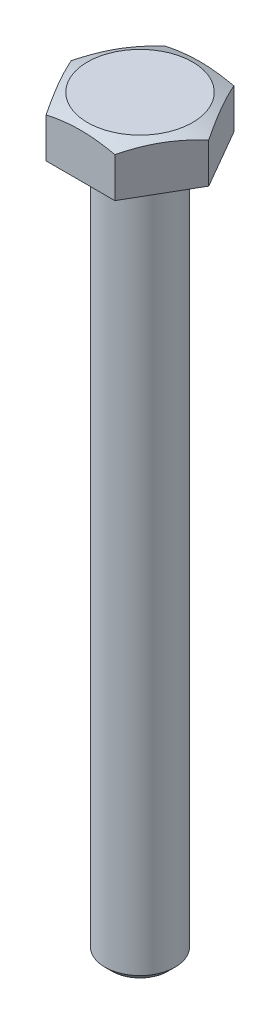
ISO-10303-21;
HEADER;
FILE_DESCRIPTION(('STEP AP214'),'2;1');
FILE_NAME('part.step','',(''),(''),'','','');
FILE_SCHEMA(('AUTOMOTIVE_DESIGN { 1 0 10303 214 1 1 1 1 }'));
ENDSEC;
DATA;
#1=APPLICATION_CONTEXT('core data for automotive mechanical design processes');
#2=APPLICATION_PROTOCOL_DEFINITION('international standard','automotive_design',2000,#1);
#3=PRODUCT_CONTEXT('',#1,'mechanical');
#4=PRODUCT('Part','Part','',(#3));
#5=PRODUCT_RELATED_PRODUCT_CATEGORY('part','',(#4));
#6=PRODUCT_DEFINITION_FORMATION('','',#4);
#7=PRODUCT_DEFINITION_CONTEXT('part definition',#1,'design');
#8=PRODUCT_DEFINITION('design','',#6,#7);
#9=PRODUCT_DEFINITION_SHAPE('','',#8);
#10=(LENGTH_UNIT() NAMED_UNIT(*) SI_UNIT(.MILLI.,.METRE.));
#11=(NAMED_UNIT(*) PLANE_ANGLE_UNIT() SI_UNIT($,.RADIAN.));
#12=(NAMED_UNIT(*) SI_UNIT($,.STERADIAN.) SOLID_ANGLE_UNIT());
#13=UNCERTAINTY_MEASURE_WITH_UNIT(LENGTH_MEASURE(1.E-05),#10,'distance_accuracy_value','');
#14=(GEOMETRIC_REPRESENTATION_CONTEXT(3) GLOBAL_UNCERTAINTY_ASSIGNED_CONTEXT((#13)) GLOBAL_UNIT_ASSIGNED_CONTEXT((#10,
#11,#12)) REPRESENTATION_CONTEXT('',''));
#15=CARTESIAN_POINT('',(0.,0.,0.));
#16=DIRECTION('',(0.,0.,1.));
#17=DIRECTION('',(1.,0.,0.));
#18=AXIS2_PLACEMENT_3D('',#15,#16,#17);
#19=CARTESIAN_POINT('',(4.90747728811192,6.7,8.49999999999995));
#20=DIRECTION('',(-0.866025403784442,0.,-0.499999999999995));
#21=DIRECTION('',(-0.499999999999995,0.,0.866025403784442));
#22=AXIS2_PLACEMENT_3D('',#19,#20,#21);
#23=PLANE('',#22);
#24=CARTESIAN_POINT('',(4.90736181805808,5.69995011906818,8.50019999999995));
#25=CARTESIAN_POINT('',(5.06766332292596,5.76919852924172,8.22254964903904));
#26=CARTESIAN_POINT('',(5.22852208946058,5.83360275520303,7.9439340925582));
#27=CARTESIAN_POINT('',(5.55136884100987,5.95096558837473,7.38474711581626));
#28=CARTESIAN_POINT('',(5.71335741295552,6.00391770493586,7.10417467896087));
#29=CARTESIAN_POINT('',(6.03834482030254,6.09655033662872,6.54127997761574));
#30=CARTESIAN_POINT('',(6.20134393866038,6.13622694619533,6.25895722303102));
#31=CARTESIAN_POINT('',(6.52805379498716,6.20065778964709,5.69307915253951));
#32=CARTESIAN_POINT('',(6.69176438030418,6.22541507941706,5.40952410103359));
#33=CARTESIAN_POINT('',(7.01653681894995,6.25855539155112,4.84700173640106));
#34=CARTESIAN_POINT('',(7.17759098231728,6.26723583654308,4.56804774267834));
#35=CARTESIAN_POINT('',(7.4997300615107,6.26871290776376,4.01008649041187));
#36=CARTESIAN_POINT('',(7.6608149787261,6.26150836860822,3.73107922946177));
#37=CARTESIAN_POINT('',(7.98249254918383,6.23157315446633,3.17391733377366));
#38=CARTESIAN_POINT('',(8.14308548631427,6.20885446130092,2.89576220732701));
#39=CARTESIAN_POINT('',(8.46357349646353,6.14893290538069,2.34066069053184));
#40=CARTESIAN_POINT('',(8.62346863468007,6.11173142642646,2.06371418725754));
#41=CARTESIAN_POINT('',(8.86926678639967,6.04436735447213,1.63797930007267));
#42=CARTESIAN_POINT('',(8.95549336359126,6.01879365253318,1.48863048741406));
#43=CARTESIAN_POINT('',(9.12765467535119,5.96410441604229,1.19043834834817));
#44=CARTESIAN_POINT('',(9.21358944651567,5.93498934386047,1.04159495855447));
#45=CARTESIAN_POINT('',(9.38562432190309,5.87331939986806,0.743621813709675));
#46=CARTESIAN_POINT('',(9.4717228383626,5.84074690620565,0.594494808745514));
#47=CARTESIAN_POINT('',(9.64362156321177,5.77256126479486,0.296757483550436));
#48=CARTESIAN_POINT('',(9.72942176208916,5.73694802099658,0.148147179795281));
#49=CARTESIAN_POINT('',(9.81507004627748,5.6999501190682,-0.000200000000001539));
#50=B_SPLINE_CURVE_WITH_KNOTS('',3,(#24,#25,#26,#27,#28,#29,#30,#31,#32,#33,#34,#35,#36,#37,#38,
#39,#40,#41,#42,#43,#44,#45,#46,#47,#48,#49),.UNSPECIFIED.,.F.,.F.,(4,2,2,2,2,2,2,2,2,2,2,2,4),
(0.,0.984051741370098,1.96865975520475,2.95355717994528,3.93825280212149,4.90454218826444,
5.87090246751688,6.8365172546141,7.80203980182691,8.32502571912641,8.84794342722947,
9.37366748381706,9.89940815289629),.UNSPECIFIED.);
#51=CARTESIAN_POINT('',(4.90747728811218,5.7,8.49999999999995));
#52=VERTEX_POINT('',#51);
#53=CARTESIAN_POINT('',(9.81495457622382,5.7,2.97505076130022E-13));
#54=VERTEX_POINT('',#53);
#55=EDGE_CURVE('E96',#52,#54,#50,.T.);
#56=ORIENTED_EDGE('',*,*,#55,.F.);
#57=DIRECTION('',(0.,-1.,0.));
#58=VECTOR('',#57,1.);
#59=CARTESIAN_POINT('',(4.90747728811192,6.7,8.49999999999995));
#60=LINE('',#59,#58);
#61=CARTESIAN_POINT('',(4.90747728811192,0.,8.49999999999995));
#62=VERTEX_POINT('',#61);
#63=EDGE_CURVE('E61',#52,#62,#60,.T.);
#64=ORIENTED_EDGE('',*,*,#63,.T.);
#65=DIRECTION('',(0.499999999999995,0.,-0.866025403784442));
#66=VECTOR('',#65,1.);
#67=CARTESIAN_POINT('',(4.90747728811192,0.,8.49999999999995));
#68=LINE('',#67,#66);
#69=CARTESIAN_POINT('',(9.81495457622365,0.,0.));
#70=VERTEX_POINT('',#69);
#71=EDGE_CURVE('E191',#62,#70,#68,.T.);
#72=ORIENTED_EDGE('',*,*,#71,.T.);
#73=DIRECTION('',(0.,-1.,0.));
#74=VECTOR('',#73,1.);
#75=CARTESIAN_POINT('',(9.81495457622365,6.7,0.));
#76=LINE('',#75,#74);
#77=EDGE_CURVE('E114',#54,#70,#76,.T.);
#78=ORIENTED_EDGE('',*,*,#77,.F.);
#79=EDGE_LOOP('',(#56,#64,#72,#78));
#80=FACE_BOUND('',#79,.T.);
#81=ADVANCED_FACE('F37',(#80),#23,.F.);
#82=CARTESIAN_POINT('',(9.81495457622365,6.7,0.));
#83=DIRECTION('',(-0.866025403784438,0.,0.500000000000001));
#84=DIRECTION('',(0.500000000000001,0.,0.866025403784438));
#85=AXIS2_PLACEMENT_3D('',#82,#83,#84);
#86=PLANE('',#85);
#87=CARTESIAN_POINT('',(9.81507004627748,5.6999501190682,0.000200000000000027));
#88=CARTESIAN_POINT('',(9.65476854140961,5.76919852924174,-0.27745035096091));
#89=CARTESIAN_POINT('',(9.49390977487498,5.83360275520305,-0.556065907441743));
#90=CARTESIAN_POINT('',(9.17106302332569,5.95096558837475,-1.11525288418368));
#91=CARTESIAN_POINT('',(9.00907445138004,6.00391770493587,-1.39582532103907));
#92=CARTESIAN_POINT('',(8.68408704403302,6.09655033662874,-1.95872002238419));
#93=CARTESIAN_POINT('',(8.52108792567518,6.13622694619535,-2.24104277696891));
#94=CARTESIAN_POINT('',(8.1943780693484,6.2006577896471,-2.80692084746042));
#95=CARTESIAN_POINT('',(8.03066748403138,6.22541507941707,-3.09047589896634));
#96=CARTESIAN_POINT('',(7.70589504538561,6.25855539155114,-3.65299826359886));
#97=CARTESIAN_POINT('',(7.54484088201827,6.26723583654309,-3.93195225732157));
#98=CARTESIAN_POINT('',(7.22270180282484,6.26871290776377,-4.48991350958804));
#99=CARTESIAN_POINT('',(7.06161688560945,6.26150836860823,-4.76892077053814));
#100=CARTESIAN_POINT('',(6.73993931515172,6.23157315446634,-5.32608266622624));
#101=CARTESIAN_POINT('',(6.57934637802127,6.20885446130094,-5.60423779267289));
#102=CARTESIAN_POINT('',(6.25885836787201,6.14893290538071,-6.15933930946805));
#103=CARTESIAN_POINT('',(6.09896322965547,6.11173142642647,-6.43628581274236));
#104=CARTESIAN_POINT('',(5.85316507793586,6.04436735447214,-6.86202069992724));
#105=CARTESIAN_POINT('',(5.76693850074426,6.01879365253319,-7.01136951258585));
#106=CARTESIAN_POINT('',(5.59477718898432,5.9641044160423,-7.30956165165176));
#107=CARTESIAN_POINT('',(5.50884241781983,5.93498934386047,-7.45840504144548));
#108=CARTESIAN_POINT('',(5.33680754243239,5.87331939986806,-7.75637818629029));
#109=CARTESIAN_POINT('',(5.25070902597288,5.84074690620565,-7.90550519125447));
#110=CARTESIAN_POINT('',(5.07881030112369,5.77256126479485,-8.20324251644957));
#111=CARTESIAN_POINT('',(4.9930101022463,5.73694802099657,-8.35185282020473));
#112=CARTESIAN_POINT('',(4.90736181805796,5.69995011906818,-8.50020000000002));
#113=B_SPLINE_CURVE_WITH_KNOTS('',3,(#87,#88,#89,#90,#91,#92,#93,#94,#95,#96,#97,#98,#99,#100,
#101,#102,#103,#104,#105,#106,#107,#108,#109,#110,#111,#112),.UNSPECIFIED.,.F.,.F.,(4,2,2,2,2,2,
2,2,2,2,2,2,4),(0.,0.984051741370094,1.96865975520474,2.95355717994527,3.93825280212147,
4.90454218826441,5.87090246751685,6.83651725461406,7.80203980182688,8.32502571912641,
8.84794342722951,9.37366748381714,9.89940815289641),.UNSPECIFIED.);
#114=CARTESIAN_POINT('',(4.90747728811206,5.7,-8.50000000000002));
#115=VERTEX_POINT('',#114);
#116=EDGE_CURVE('E91',#54,#115,#113,.T.);
#117=ORIENTED_EDGE('',*,*,#116,.F.);
#118=ORIENTED_EDGE('',*,*,#77,.T.);
#119=DIRECTION('',(-0.500000000000001,0.,-0.866025403784438));
#120=VECTOR('',#119,1.);
#121=CARTESIAN_POINT('',(9.81495457622365,0.,0.));
#122=LINE('',#121,#120);
#123=CARTESIAN_POINT('',(4.9074772881118,0.,-8.50000000000002));
#124=VERTEX_POINT('',#123);
#125=EDGE_CURVE('E112',#70,#124,#122,.T.);
#126=ORIENTED_EDGE('',*,*,#125,.T.);
#127=DIRECTION('',(0.,-1.,0.));
#128=VECTOR('',#127,1.);
#129=CARTESIAN_POINT('',(4.9074772881118,6.7,-8.50000000000002));
#130=LINE('',#129,#128);
#131=EDGE_CURVE('E105',#115,#124,#130,.T.);
#132=ORIENTED_EDGE('',*,*,#131,.F.);
#133=EDGE_LOOP('',(#117,#118,#126,#132));
#134=FACE_BOUND('',#133,.T.);
#135=ADVANCED_FACE('F110',(#134),#86,.F.);
#136=CARTESIAN_POINT('',(4.9074772881118,6.7,-8.50000000000002));
#137=DIRECTION('',(0.,0.,1.));
#138=DIRECTION('',(1.,0.,0.));
#139=AXIS2_PLACEMENT_3D('',#136,#137,#138);
#140=PLANE('',#139);
#141=CARTESIAN_POINT('',(14.7734430127443,2.57715623788736,-8.50000000000006));
#142=CARTESIAN_POINT('',(14.5301100118234,2.66826317609697,-8.50000000000006));
#143=CARTESIAN_POINT('',(14.2865950674088,2.75888401437732,-8.50000000000006));
#144=CARTESIAN_POINT('',(13.7991535895868,2.93901853009639,-8.50000000000005));
#145=CARTESIAN_POINT('',(13.5552270524079,3.02853219732672,-8.50000000000005));
#146=CARTESIAN_POINT('',(12.822693267771,3.29523368976502,-8.50000000000005));
#147=CARTESIAN_POINT('',(12.3334035389433,3.47055507329112,-8.50000000000005));
#148=CARTESIAN_POINT('',(11.3492616474874,3.81593130281965,-8.50000000000004));
#149=CARTESIAN_POINT('',(10.8543942108451,3.98594276559382,-8.50000000000004));
#150=CARTESIAN_POINT('',(9.8618060761074,4.31740205687568,-8.50000000000004));
#151=CARTESIAN_POINT('',(9.36408549327459,4.47885022866236,-8.50000000000004));
#152=CARTESIAN_POINT('',(8.37553211094848,4.78707952362426,-8.50000000000003));
#153=CARTESIAN_POINT('',(7.88477355941962,4.93409711588044,-8.50000000000003));
#154=CARTESIAN_POINT('',(6.899025516416,5.21352452169852,-8.50000000000003));
#155=CARTESIAN_POINT('',(6.40403567953657,5.34593313020276,-8.50000000000002));
#156=CARTESIAN_POINT('',(5.41035963620797,5.59087718020008,-8.50000000000002));
#157=CARTESIAN_POINT('',(4.91168520810618,5.70345973163224,-8.50000000000002));
#158=CARTESIAN_POINT('',(3.90918343469131,5.90288735275823,-8.50000000000002));
#159=CARTESIAN_POINT('',(3.40535716282511,5.98973767540247,-8.50000000000001));
#160=CARTESIAN_POINT('',(2.50282948547589,6.11559068739164,-8.50000000000001));
#161=CARTESIAN_POINT('',(2.10501472325678,6.1608842917115,-8.50000000000001));
#162=CARTESIAN_POINT('',(1.30743525754827,6.22868020814041,-8.50000000000001));
#163=CARTESIAN_POINT('',(0.907670733038793,6.25118457406189,-8.50000000000001));
#164=CARTESIAN_POINT('',(0.107677021656474,6.27178115178249,-8.5));
#165=CARTESIAN_POINT('',(-0.292551880631372,6.26988418227283,-8.5));
#166=CARTESIAN_POINT('',(-1.09215859318782,6.24184717244386,-8.5));
#167=CARTESIAN_POINT('',(-1.49153636207824,6.21570597926607,-8.5));
#168=CARTESIAN_POINT('',(-2.28882913220445,6.14096616545284,-8.49999999999999));
#169=CARTESIAN_POINT('',(-2.68674045843191,6.09232917276911,-8.49999999999999));
#170=CARTESIAN_POINT('',(-3.47970051411603,5.9755356614,-8.49999999999999));
#171=CARTESIAN_POINT('',(-3.87474877782002,5.9073760368149,-8.49999999999999));
#172=CARTESIAN_POINT('',(-4.66212895795684,5.75475028734512,-8.49999999999999));
#173=CARTESIAN_POINT('',(-5.05445705094207,5.67026471500982,-8.49999999999999));
#174=CARTESIAN_POINT('',(-5.83601360558379,5.48815169024151,-8.49999999999998));
#175=CARTESIAN_POINT('',(-6.2252421052763,5.39052439933841,-8.49999999999998));
#176=CARTESIAN_POINT('',(-6.96080439380528,5.19541062206761,-8.49999999999998));
#177=CARTESIAN_POINT('',(-7.30741345758486,5.09895260628915,-8.49999999999998));
#178=CARTESIAN_POINT('',(-7.99862972798956,4.899164661348,-8.49999999999997));
#179=CARTESIAN_POINT('',(-8.34323697381084,4.79583486723315,-8.49999999999997));
#180=CARTESIAN_POINT('',(-9.03046125788818,4.58364933190211,-8.49999999999997));
#181=CARTESIAN_POINT('',(-9.37307957397106,4.47479771263226,-8.49999999999997));
#182=CARTESIAN_POINT('',(-10.0568263229242,4.25250900078127,-8.49999999999997));
#183=CARTESIAN_POINT('',(-10.3979547356867,4.13907184652406,-8.49999999999997));
#184=CARTESIAN_POINT('',(-11.0767470456213,3.90915995206643,-8.49999999999996));
#185=CARTESIAN_POINT('',(-11.414419134551,3.79270934108376,-8.49999999999996));
#186=CARTESIAN_POINT('',(-12.0886786796345,3.55670973179791,-8.49999999999996));
#187=CARTESIAN_POINT('',(-12.4252661310969,3.43716072011374,-8.49999999999996));
#188=CARTESIAN_POINT('',(-13.0975834236643,3.19544928447036,-8.49999999999996));
#189=CARTESIAN_POINT('',(-13.4333130595504,3.07328629070083,-8.49999999999996));
#190=CARTESIAN_POINT('',(-14.1039563078116,2.8267681148035,-8.49999999999995));
#191=CARTESIAN_POINT('',(-14.4388699428334,2.70241299432154,-8.49999999999995));
#192=CARTESIAN_POINT('',(-14.7734430127444,2.57715623788729,-8.49999999999995));
#193=B_SPLINE_CURVE_WITH_KNOTS('',3,(#141,#142,#143,#144,#145,#146,#147,#148,#149,#150,#151,
#152,#153,#154,#155,#156,#157,#158,#159,#160,#161,#162,#163,#164,#165,#166,#167,#168,#169,#170,
#171,#172,#173,#174,#175,#176,#177,#178,#179,#180,#181,#182,#183,#184,#185,#186,#187,#188,#189,
#190,#191,#192),.UNSPECIFIED.,.F.,.F.,(4,2,2,2,2,2,2,2,2,2,2,2,2,2,2,2,2,2,2,2,2,2,2,2,2,4),(0.,
0.779487829976945,1.55898284166632,3.11820260673362,4.68791563802791,6.25756569617592,
7.79432077486855,9.33120252192897,10.8643816105208,12.3972475015419,13.5978320170255,
14.7983083237626,15.9982524000121,17.1982535387876,18.4003091627138,19.6025561307145,
20.8062441417462,22.009917359136,23.0891762986646,24.1684140342864,25.2468576645859,
26.3253158049244,27.3968616589014,28.4684121413098,29.5401986350547,30.611955036507),.UNSPECIFIED.);
#194=CARTESIAN_POINT('',(-4.90747728811182,5.7,-8.50000000000006));
#195=VERTEX_POINT('',#194);
#196=EDGE_CURVE('E94',#115,#195,#193,.T.);
#197=ORIENTED_EDGE('',*,*,#196,.F.);
#198=ORIENTED_EDGE('',*,*,#131,.T.);
#199=DIRECTION('',(-1.,0.,0.));
#200=VECTOR('',#199,1.);
#201=CARTESIAN_POINT('',(4.9074772881118,0.,-8.50000000000002));
#202=LINE('',#201,#200);
#203=CARTESIAN_POINT('',(-4.90747728811186,0.,-8.49999999999999));
#204=VERTEX_POINT('',#203);
#205=EDGE_CURVE('E214',#124,#204,#202,.T.);
#206=ORIENTED_EDGE('',*,*,#205,.T.);
#207=DIRECTION('',(0.,-1.,0.));
#208=VECTOR('',#207,1.);
#209=CARTESIAN_POINT('',(-4.90747728811186,6.7,-8.49999999999999));
#210=LINE('',#209,#208);
#211=EDGE_CURVE('E107',#195,#204,#210,.T.);
#212=ORIENTED_EDGE('',*,*,#211,.F.);
#213=EDGE_LOOP('',(#197,#198,#206,#212));
#214=FACE_BOUND('',#213,.T.);
#215=ADVANCED_FACE('F103',(#214),#140,.F.);
#216=CARTESIAN_POINT('',(-4.90747728811186,6.7,-8.49999999999999));
#217=DIRECTION('',(0.866025403784442,0.,0.499999999999995));
#218=DIRECTION('',(0.499999999999995,0.,-0.866025403784442));
#219=AXIS2_PLACEMENT_3D('',#216,#217,#218);
#220=PLANE('',#219);
#221=CARTESIAN_POINT('',(-4.90736181805802,5.69995011906814,-8.50019999999999));
#222=CARTESIAN_POINT('',(-5.0676633229259,5.76919852924168,-8.22254964903907));
#223=CARTESIAN_POINT('',(-5.22852208946053,5.83360275520299,-7.94393409255823));
#224=CARTESIAN_POINT('',(-5.55136884100982,5.95096558837469,-7.38474711581629));
#225=CARTESIAN_POINT('',(-5.71335741295547,6.00391770493582,-7.10417467896089));
#226=CARTESIAN_POINT('',(-6.03834482030249,6.09655033662868,-6.54127997761576));
#227=CARTESIAN_POINT('',(-6.20134393866033,6.13622694619529,-6.25895722303104));
#228=CARTESIAN_POINT('',(-6.52805379498711,6.20065778964704,-5.69307915253952));
#229=CARTESIAN_POINT('',(-6.69176438030413,6.22541507941701,-5.4095241010336));
#230=CARTESIAN_POINT('',(-7.0165368189499,6.25855539155108,-4.84700173640107));
#231=CARTESIAN_POINT('',(-7.17759098231723,6.26723583654303,-4.56804774267835));
#232=CARTESIAN_POINT('',(-7.49973006151066,6.26871290776371,-4.01008649041187));
#233=CARTESIAN_POINT('',(-7.66081497872606,6.26150836860816,-3.73107922946177));
#234=CARTESIAN_POINT('',(-7.98249254918379,6.23157315446627,-3.17391733377366));
#235=CARTESIAN_POINT('',(-8.14308548631424,6.20885446130087,-2.89576220732701));
#236=CARTESIAN_POINT('',(-8.46357349646349,6.14893290538064,-2.34066069053183));
#237=CARTESIAN_POINT('',(-8.62346863468004,6.1117314264264,-2.06371418725753));
#238=CARTESIAN_POINT('',(-8.86926678639964,6.04436735447207,-1.63797930007265));
#239=CARTESIAN_POINT('',(-8.95549336359124,6.01879365253312,-1.48863048741404));
#240=CARTESIAN_POINT('',(-9.12765467535116,5.96410441604223,-1.19043834834814));
#241=CARTESIAN_POINT('',(-9.21358944651565,5.9349893438604,-1.04159495855443));
#242=CARTESIAN_POINT('',(-9.38562432190308,5.873319399868,-0.743621813709631));
#243=CARTESIAN_POINT('',(-9.47172283836258,5.84074690620558,-0.594494808745465));
#244=CARTESIAN_POINT('',(-9.64362156321176,5.77256126479479,-0.296757483550378));
#245=CARTESIAN_POINT('',(-9.72942176208915,5.73694802099651,-0.148147179795219));
#246=CARTESIAN_POINT('',(-9.81507004627748,5.69995011906812,0.000200000000067119));
#247=B_SPLINE_CURVE_WITH_KNOTS('',3,(#221,#222,#223,#224,#225,#226,#227,#228,#229,#230,#231,
#232,#233,#234,#235,#236,#237,#238,#239,#240,#241,#242,#243,#244,#245,#246),.UNSPECIFIED.,.F.,
.F.,(4,2,2,2,2,2,2,2,2,2,2,2,4),(0.,0.984051741370108,1.96865975520477,2.9535571799453,
3.93825280212151,4.90454218826447,5.87090246751692,6.83651725461414,7.80203980182697,
8.32502571912648,8.84794342722955,9.37366748381715,9.89940815289641),.UNSPECIFIED.);
#248=CARTESIAN_POINT('',(-9.81495457622364,5.7,0.));
#249=VERTEX_POINT('',#248);
#250=EDGE_CURVE('E108',#195,#249,#247,.T.);
#251=ORIENTED_EDGE('',*,*,#250,.F.);
#252=ORIENTED_EDGE('',*,*,#211,.T.);
#253=DIRECTION('',(-0.499999999999995,0.,0.866025403784442));
#254=VECTOR('',#253,1.);
#255=CARTESIAN_POINT('',(-4.90747728811186,0.,-8.49999999999999));
#256=LINE('',#255,#254);
#257=CARTESIAN_POINT('',(-9.81495457622364,0.,0.));
#258=VERTEX_POINT('',#257);
#259=EDGE_CURVE('E211',#204,#258,#256,.T.);
#260=ORIENTED_EDGE('',*,*,#259,.T.);
#261=DIRECTION('',(0.,-1.,0.));
#262=VECTOR('',#261,1.);
#263=CARTESIAN_POINT('',(-9.81495457622364,6.7,0.));
#264=LINE('',#263,#262);
#265=EDGE_CURVE('E118',#249,#258,#264,.T.);
#266=ORIENTED_EDGE('',*,*,#265,.F.);
#267=EDGE_LOOP('',(#251,#252,#260,#266));
#268=FACE_BOUND('',#267,.T.);
#269=ADVANCED_FACE('F212',(#268),#220,.F.);
#270=CARTESIAN_POINT('',(-9.81495457622364,6.7,0.));
#271=DIRECTION('',(0.866025403784435,0.,-0.500000000000007));
#272=DIRECTION('',(-0.500000000000007,0.,-0.866025403784435));
#273=AXIS2_PLACEMENT_3D('',#270,#271,#272);
#274=PLANE('',#273);
#275=CARTESIAN_POINT('',(-9.81507004627748,5.69995011906812,-0.000199999999931583));
#276=CARTESIAN_POINT('',(-9.6547685414096,5.76919852924167,0.277450350960982));
#277=CARTESIAN_POINT('',(-9.49390977487497,5.83360275520298,0.556065907441819));
#278=CARTESIAN_POINT('',(-9.17106302332567,5.95096558837468,1.11525288418376));
#279=CARTESIAN_POINT('',(-9.00907445138002,6.0039177049358,1.39582532103916));
#280=CARTESIAN_POINT('',(-8.68408704403299,6.09655033662867,1.95872002238429));
#281=CARTESIAN_POINT('',(-8.52108792567513,6.13622694619528,2.24104277696901));
#282=CARTESIAN_POINT('',(-8.19437806934835,6.20065778964703,2.80692084746052));
#283=CARTESIAN_POINT('',(-8.03066748403132,6.22541507941701,3.09047589896645));
#284=CARTESIAN_POINT('',(-7.70589504538554,6.25855539155107,3.65299826359897));
#285=CARTESIAN_POINT('',(-7.5448408820182,6.26723583654303,3.9319522573217));
#286=CARTESIAN_POINT('',(-7.22270180282476,6.26871290776371,4.48991350958818));
#287=CARTESIAN_POINT('',(-7.06161688560936,6.26150836860816,4.76892077053828));
#288=CARTESIAN_POINT('',(-6.73993931515162,6.23157315446628,5.32608266622638));
#289=CARTESIAN_POINT('',(-6.57934637802117,6.20885446130087,5.60423779267304));
#290=CARTESIAN_POINT('',(-6.2588583678719,6.14893290538064,6.15933930946821));
#291=CARTESIAN_POINT('',(-6.09896322965536,6.1117314264264,6.43628581274251));
#292=CARTESIAN_POINT('',(-5.85316507793575,6.04436735447208,6.86202069992739));
#293=CARTESIAN_POINT('',(-5.76693850074415,6.01879365253313,7.01136951258599));
#294=CARTESIAN_POINT('',(-5.59477718898423,5.96410441604224,7.30956165165188));
#295=CARTESIAN_POINT('',(-5.50884241781973,5.93498934386041,7.45840504144558));
#296=CARTESIAN_POINT('',(-5.33680754243231,5.87331939986801,7.75637818629038));
#297=CARTESIAN_POINT('',(-5.25070902597281,5.8407469062056,7.90550519125454));
#298=CARTESIAN_POINT('',(-5.07881030112363,5.77256126479481,8.20324251644962));
#299=CARTESIAN_POINT('',(-4.99301010224623,5.73694802099653,8.35185282020477));
#300=CARTESIAN_POINT('',(-4.9073618180579,5.69995011906814,8.50020000000005));
#301=B_SPLINE_CURVE_WITH_KNOTS('',3,(#275,#276,#277,#278,#279,#280,#281,#282,#283,#284,#285,
#286,#287,#288,#289,#290,#291,#292,#293,#294,#295,#296,#297,#298,#299,#300),.UNSPECIFIED.,.F.,
.F.,(4,2,2,2,2,2,2,2,2,2,2,2,4),(0.,0.984051741370113,1.96865975520478,2.95355717994532,
3.93825280212154,4.9045421882645,5.87090246751695,6.83651725461419,7.80203980182702,
8.32502571912652,8.84794342722958,9.37366748381717,9.89940815289641),.UNSPECIFIED.);
#302=CARTESIAN_POINT('',(-4.90747728811174,5.70000000000002,8.50000000000005));
#303=VERTEX_POINT('',#302);
#304=EDGE_CURVE('E53',#249,#303,#301,.T.);
#305=ORIENTED_EDGE('',*,*,#304,.F.);
#306=ORIENTED_EDGE('',*,*,#265,.T.);
#307=DIRECTION('',(0.500000000000007,0.,0.866025403784435));
#308=VECTOR('',#307,1.);
#309=CARTESIAN_POINT('',(-9.81495457622364,0.,0.));
#310=LINE('',#309,#308);
#311=CARTESIAN_POINT('',(-4.90747728811174,0.,8.50000000000005));
#312=VERTEX_POINT('',#311);
#313=EDGE_CURVE('E200',#258,#312,#310,.T.);
#314=ORIENTED_EDGE('',*,*,#313,.T.);
#315=DIRECTION('',(0.,-1.,0.));
#316=VECTOR('',#315,1.);
#317=CARTESIAN_POINT('',(-4.90747728811174,6.7,8.50000000000005));
#318=LINE('',#317,#316);
#319=EDGE_CURVE('E197',#303,#312,#318,.T.);
#320=ORIENTED_EDGE('',*,*,#319,.F.);
#321=EDGE_LOOP('',(#305,#306,#314,#320));
#322=FACE_BOUND('',#321,.T.);
#323=ADVANCED_FACE('F207',(#322),#274,.F.);
#324=CARTESIAN_POINT('',(-4.90747728811174,6.7,8.50000000000005));
#325=DIRECTION('',(0.,0.,-1.));
#326=DIRECTION('',(-1.,0.,0.));
#327=AXIS2_PLACEMENT_3D('',#324,#325,#326);
#328=PLANE('',#327);
#329=CARTESIAN_POINT('',(-14.7734430127443,2.57715623788729,8.50000000000015));
#330=CARTESIAN_POINT('',(-14.5301100118233,2.66826317609691,8.50000000000015));
#331=CARTESIAN_POINT('',(-14.2865950674087,2.75888401437726,8.50000000000015));
#332=CARTESIAN_POINT('',(-13.7991535895867,2.93901853009633,8.50000000000015));
#333=CARTESIAN_POINT('',(-13.5552270524078,3.02853219732666,8.50000000000014));
#334=CARTESIAN_POINT('',(-12.822693267771,3.29523368976496,8.50000000000014));
#335=CARTESIAN_POINT('',(-12.3334035389432,3.47055507329107,8.50000000000013));
#336=CARTESIAN_POINT('',(-11.3492616474874,3.8159313028196,8.50000000000012));
#337=CARTESIAN_POINT('',(-10.854394210845,3.98594276559377,8.50000000000012));
#338=CARTESIAN_POINT('',(-9.86180607610729,4.31740205687564,8.5000000000001));
#339=CARTESIAN_POINT('',(-9.36408549327448,4.47885022866232,8.5000000000001));
#340=CARTESIAN_POINT('',(-8.37553211094837,4.78707952362422,8.50000000000009));
#341=CARTESIAN_POINT('',(-7.8847735594195,4.93409711588041,8.50000000000008));
#342=CARTESIAN_POINT('',(-6.89902551641587,5.21352452169849,8.50000000000007));
#343=CARTESIAN_POINT('',(-6.40403567953645,5.34593313020274,8.50000000000007));
#344=CARTESIAN_POINT('',(-5.41035963620783,5.59087718020005,8.50000000000006));
#345=CARTESIAN_POINT('',(-4.91168520810604,5.70345973163222,8.50000000000005));
#346=CARTESIAN_POINT('',(-3.90918343469116,5.90288735275822,8.50000000000004));
#347=CARTESIAN_POINT('',(-3.40535716282496,5.98973767540246,8.50000000000004));
#348=CARTESIAN_POINT('',(-2.50282948547573,6.11559068739163,8.50000000000003));
#349=CARTESIAN_POINT('',(-2.10501472325663,6.1608842917115,8.50000000000002));
#350=CARTESIAN_POINT('',(-1.30743525754812,6.2286802081404,8.50000000000002));
#351=CARTESIAN_POINT('',(-0.907670733038641,6.25118457406189,8.50000000000001));
#352=CARTESIAN_POINT('',(-0.107677021656323,6.27178115178249,8.5));
#353=CARTESIAN_POINT('',(0.292551880631523,6.26988418227283,8.5));
#354=CARTESIAN_POINT('',(1.09215859318797,6.24184717244386,8.49999999999999));
#355=CARTESIAN_POINT('',(1.49153636207839,6.21570597926608,8.49999999999999));
#356=CARTESIAN_POINT('',(2.2888291322046,6.14096616545285,8.49999999999998));
#357=CARTESIAN_POINT('',(2.68674045843206,6.09232917276912,8.49999999999997));
#358=CARTESIAN_POINT('',(3.47970051411618,5.97553566140001,8.49999999999997));
#359=CARTESIAN_POINT('',(3.87474877782017,5.90737603681491,8.49999999999996));
#360=CARTESIAN_POINT('',(4.66212895795699,5.75475028734513,8.49999999999995));
#361=CARTESIAN_POINT('',(5.05445705094222,5.67026471500984,8.49999999999995));
#362=CARTESIAN_POINT('',(5.83601360558394,5.48815169024153,8.49999999999994));
#363=CARTESIAN_POINT('',(6.22524210527646,5.39052439933843,8.49999999999994));
#364=CARTESIAN_POINT('',(6.96080439380544,5.19541062206763,8.49999999999993));
#365=CARTESIAN_POINT('',(7.30741345758501,5.09895260628918,8.49999999999992));
#366=CARTESIAN_POINT('',(7.9986297279897,4.89916466134803,8.49999999999992));
#367=CARTESIAN_POINT('',(8.34323697381097,4.79583486723318,8.49999999999991));
#368=CARTESIAN_POINT('',(9.03046125788831,4.58364933190214,8.49999999999991));
#369=CARTESIAN_POINT('',(9.37307957397118,4.4747977126323,8.4999999999999));
#370=CARTESIAN_POINT('',(10.0568263229243,4.2525090007813,8.4999999999999));
#371=CARTESIAN_POINT('',(10.3979547356868,4.1390718465241,8.49999999999989));
#372=CARTESIAN_POINT('',(11.0767470456214,3.90915995206648,8.49999999999989));
#373=CARTESIAN_POINT('',(11.4144191345511,3.79270934108381,8.49999999999988));
#374=CARTESIAN_POINT('',(12.0886786796346,3.55670973179796,8.49999999999988));
#375=CARTESIAN_POINT('',(12.425266131097,3.43716072011379,8.49999999999987));
#376=CARTESIAN_POINT('',(13.0975834236644,3.19544928447042,8.49999999999986));
#377=CARTESIAN_POINT('',(13.4333130595505,3.07328629070089,8.49999999999986));
#378=CARTESIAN_POINT('',(14.1039563078117,2.82676811480356,8.49999999999985));
#379=CARTESIAN_POINT('',(14.4388699428334,2.7024129943216,8.49999999999985));
#380=CARTESIAN_POINT('',(14.7734430127444,2.57715623788736,8.49999999999985));
#381=B_SPLINE_CURVE_WITH_KNOTS('',3,(#329,#330,#331,#332,#333,#334,#335,#336,#337,#338,#339,
#340,#341,#342,#343,#344,#345,#346,#347,#348,#349,#350,#351,#352,#353,#354,#355,#356,#357,#358,
#359,#360,#361,#362,#363,#364,#365,#366,#367,#368,#369,#370,#371,#372,#373,#374,#375,#376,#377,
#378,#379,#380),.UNSPECIFIED.,.F.,.F.,(4,2,2,2,2,2,2,2,2,2,2,2,2,2,2,2,2,2,2,2,2,2,2,2,2,4),(0.,
0.779487829976951,1.55898284166634,3.11820260673364,4.68791563802795,6.25756569617597,
7.79432077486862,9.33120252192905,10.8643816105209,12.397247501542,13.5978320170256,
14.7983083237627,15.9982524000122,17.1982535387877,18.4003091627139,19.6025561307146,
20.8062441417463,22.0099173591361,23.0891762986647,24.1684140342864,25.246857664586,
26.3253158049244,27.3968616589015,28.4684121413098,29.5401986350547,30.611955036507),.UNSPECIFIED.);
#382=EDGE_CURVE('E132',#303,#52,#381,.T.);
#383=ORIENTED_EDGE('',*,*,#382,.F.);
#384=ORIENTED_EDGE('',*,*,#319,.T.);
#385=DIRECTION('',(1.,0.,0.));
#386=VECTOR('',#385,1.);
#387=CARTESIAN_POINT('',(-4.90747728811174,0.,8.50000000000005));
#388=LINE('',#387,#386);
#389=EDGE_CURVE('E195',#312,#62,#388,.T.);
#390=ORIENTED_EDGE('',*,*,#389,.T.);
#391=ORIENTED_EDGE('',*,*,#63,.F.);
#392=EDGE_LOOP('',(#383,#384,#390,#391));
#393=FACE_BOUND('',#392,.T.);
#394=ADVANCED_FACE('F146',(#393),#328,.F.);
#395=CARTESIAN_POINT('',(0.,0.,0.));
#396=DIRECTION('',(0.,1.,0.));
#397=DIRECTION('',(0.,0.,1.));
#398=AXIS2_PLACEMENT_3D('',#395,#396,#397);
#399=PLANE('',#398);
#400=CARTESIAN_POINT('',(0.,0.,0.));
#401=DIRECTION('',(0.,-1.,0.));
#402=DIRECTION('',(0.,0.,-1.));
#403=AXIS2_PLACEMENT_3D('',#400,#401,#402);
#404=CIRCLE('',#403,5.);
#405=CARTESIAN_POINT('',(0.,0.,-5.));
#406=VERTEX_POINT('',#405);
#407=EDGE_CURVE('E116',#406,#406,#404,.T.);
#408=ORIENTED_EDGE('',*,*,#407,.F.);
#409=EDGE_LOOP('',(#408));
#410=FACE_BOUND('',#409,.T.);
#411=ORIENTED_EDGE('',*,*,#71,.F.);
#412=ORIENTED_EDGE('',*,*,#389,.F.);
#413=ORIENTED_EDGE('',*,*,#313,.F.);
#414=ORIENTED_EDGE('',*,*,#259,.F.);
#415=ORIENTED_EDGE('',*,*,#205,.F.);
#416=ORIENTED_EDGE('',*,*,#125,.F.);
#417=EDGE_LOOP('',(#411,#412,#413,#414,#415,#416));
#418=FACE_BOUND('',#417,.T.);
#419=ADVANCED_FACE('F154',(#410,#418),#399,.F.);
#420=CARTESIAN_POINT('',(0.,5.7,0.));
#421=DIRECTION('',(0.,-1.,0.));
#422=DIRECTION('',(0.,0.,-1.));
#423=AXIS2_PLACEMENT_3D('',#420,#421,#422);
#424=CONICAL_SURFACE('',#423,9.81495457622373,1.16303356770506);
#425=CARTESIAN_POINT('',(0.,6.7,0.));
#426=DIRECTION('',(0.,-1.,0.));
#427=DIRECTION('',(0.,0.,-1.));
#428=AXIS2_PLACEMENT_3D('',#425,#426,#427);
#429=CIRCLE('',#428,7.50000000000009);
#430=CARTESIAN_POINT('',(0.,6.7,-7.50000000000009));
#431=VERTEX_POINT('',#430);
#432=EDGE_CURVE('E129',#431,#431,#429,.T.);
#433=ORIENTED_EDGE('',*,*,#432,.T.);
#434=EDGE_LOOP('',(#433));
#435=FACE_BOUND('',#434,.T.);
#436=ORIENTED_EDGE('',*,*,#55,.T.);
#437=ORIENTED_EDGE('',*,*,#116,.T.);
#438=ORIENTED_EDGE('',*,*,#196,.T.);
#439=ORIENTED_EDGE('',*,*,#250,.T.);
#440=ORIENTED_EDGE('',*,*,#304,.T.);
#441=ORIENTED_EDGE('',*,*,#382,.T.);
#442=EDGE_LOOP('',(#436,#437,#438,#439,#440,#441));
#443=FACE_BOUND('',#442,.T.);
#444=ADVANCED_FACE('F93',(#435,#443),#424,.T.);
#445=CARTESIAN_POINT('',(0.,6.7,0.));
#446=DIRECTION('',(0.,1.,0.));
#447=DIRECTION('',(0.,0.,1.));
#448=AXIS2_PLACEMENT_3D('',#445,#446,#447);
#449=PLANE('',#448);
#450=ORIENTED_EDGE('',*,*,#432,.F.);
#451=EDGE_LOOP('',(#450));
#452=FACE_BOUND('',#451,.T.);
#453=ADVANCED_FACE('F153',(#452),#449,.T.);
#454=CARTESIAN_POINT('',(0.,-100.,0.));
#455=DIRECTION('',(0.,1.,0.));
#456=DIRECTION('',(0.,0.,1.));
#457=AXIS2_PLACEMENT_3D('',#454,#455,#456);
#458=CYLINDRICAL_SURFACE('',#457,5.);
#459=CARTESIAN_POINT('',(0.,-99.,0.));
#460=DIRECTION('',(0.,-1.,0.));
#461=DIRECTION('',(0.,0.,-1.));
#462=AXIS2_PLACEMENT_3D('',#459,#460,#461);
#463=CIRCLE('',#462,5.);
#464=CARTESIAN_POINT('',(0.,-99.,-5.));
#465=VERTEX_POINT('',#464);
#466=EDGE_CURVE('E11',#465,#465,#463,.F.);
#467=ORIENTED_EDGE('',*,*,#466,.T.);
#468=EDGE_LOOP('',(#467));
#469=FACE_BOUND('',#468,.T.);
#470=ORIENTED_EDGE('',*,*,#407,.T.);
#471=EDGE_LOOP('',(#470));
#472=FACE_BOUND('',#471,.T.);
#473=ADVANCED_FACE('F156',(#469,#472),#458,.T.);
#474=CARTESIAN_POINT('',(0.,-100.,0.));
#475=DIRECTION('',(0.,-1.,0.));
#476=DIRECTION('',(0.,0.,-1.));
#477=AXIS2_PLACEMENT_3D('',#474,#475,#476);
#478=PLANE('',#477);
#479=CARTESIAN_POINT('',(0.,-100.,0.));
#480=DIRECTION('',(0.,-1.,0.));
#481=DIRECTION('',(0.,0.,-1.));
#482=AXIS2_PLACEMENT_3D('',#479,#480,#481);
#483=CIRCLE('',#482,3.99999999999998);
#484=CARTESIAN_POINT('',(0.,-100.,-3.99999999999998));
#485=VERTEX_POINT('',#484);
#486=EDGE_CURVE('E46',#485,#485,#483,.T.);
#487=ORIENTED_EDGE('',*,*,#486,.T.);
#488=EDGE_LOOP('',(#487));
#489=FACE_BOUND('',#488,.T.);
#490=ADVANCED_FACE('F260',(#489),#478,.T.);
#491=CARTESIAN_POINT('',(0.,-100.,0.));
#492=DIRECTION('',(0.,1.,0.));
#493=DIRECTION('',(0.,0.,1.));
#494=AXIS2_PLACEMENT_3D('',#491,#492,#493);
#495=CONICAL_SURFACE('',#494,3.99999999999998,0.785398163397446);
#496=ORIENTED_EDGE('',*,*,#466,.F.);
#497=EDGE_LOOP('',(#496));
#498=FACE_BOUND('',#497,.T.);
#499=ORIENTED_EDGE('',*,*,#486,.F.);
#500=EDGE_LOOP('',(#499));
#501=FACE_BOUND('',#500,.T.);
#502=ADVANCED_FACE('F40',(#498,#501),#495,.T.);
#503=CLOSED_SHELL('',(#81,#135,#215,#269,#323,#394,#419,#444,#453,#473,#490,#502));
#504=MANIFOLD_SOLID_BREP('B2',#503);
#505=ADVANCED_BREP_SHAPE_REPRESENTATION('',(#18,#504),#14);
#506=SHAPE_DEFINITION_REPRESENTATION(#9,#505);
ENDSEC;
END-ISO-10303-21;
